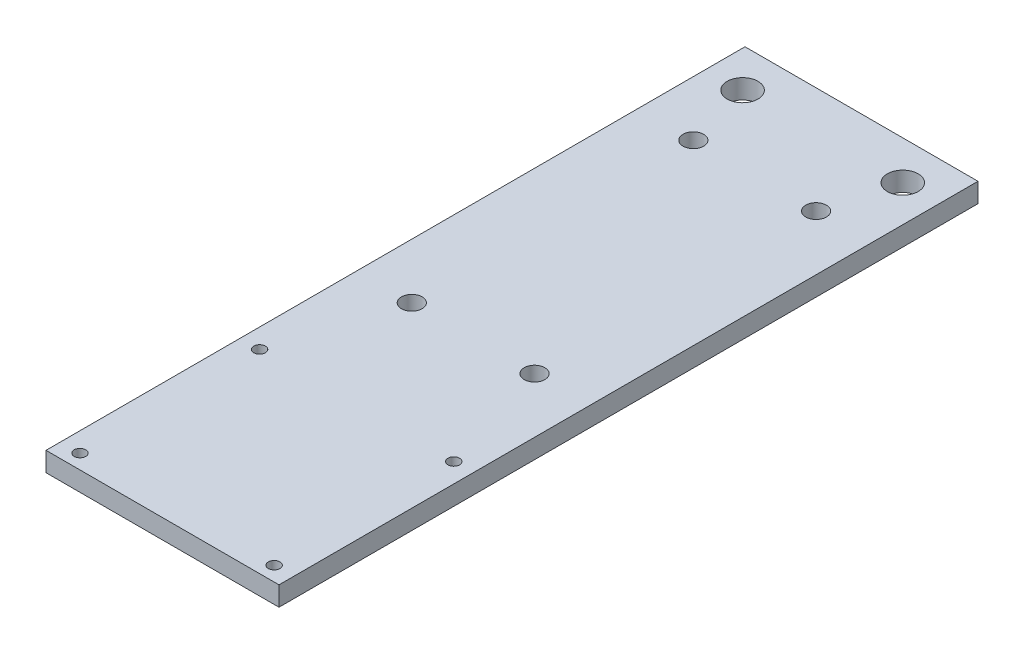
ISO-10303-21;
HEADER;
FILE_DESCRIPTION(('STEP AP214'),'2;1');
FILE_NAME('part.step','',(''),(''),'','','');
FILE_SCHEMA(('AUTOMOTIVE_DESIGN { 1 0 10303 214 1 1 1 1 }'));
ENDSEC;
DATA;
#1=APPLICATION_CONTEXT('core data for automotive mechanical design processes');
#2=APPLICATION_PROTOCOL_DEFINITION('international standard','automotive_design',2000,#1);
#3=PRODUCT_CONTEXT('',#1,'mechanical');
#4=PRODUCT('Part','Part','',(#3));
#5=PRODUCT_RELATED_PRODUCT_CATEGORY('part','',(#4));
#6=PRODUCT_DEFINITION_FORMATION('','',#4);
#7=PRODUCT_DEFINITION_CONTEXT('part definition',#1,'design');
#8=PRODUCT_DEFINITION('design','',#6,#7);
#9=PRODUCT_DEFINITION_SHAPE('','',#8);
#10=(LENGTH_UNIT() NAMED_UNIT(*) SI_UNIT(.MILLI.,.METRE.));
#11=(NAMED_UNIT(*) PLANE_ANGLE_UNIT() SI_UNIT($,.RADIAN.));
#12=(NAMED_UNIT(*) SI_UNIT($,.STERADIAN.) SOLID_ANGLE_UNIT());
#13=UNCERTAINTY_MEASURE_WITH_UNIT(LENGTH_MEASURE(1.E-05),#10,'distance_accuracy_value','');
#14=(GEOMETRIC_REPRESENTATION_CONTEXT(3) GLOBAL_UNCERTAINTY_ASSIGNED_CONTEXT((#13)) GLOBAL_UNIT_ASSIGNED_CONTEXT((#10,
#11,#12)) REPRESENTATION_CONTEXT('',''));
#15=CARTESIAN_POINT('',(0.,0.,0.));
#16=DIRECTION('',(0.,0.,1.));
#17=DIRECTION('',(1.,0.,0.));
#18=AXIS2_PLACEMENT_3D('',#15,#16,#17);
#19=CARTESIAN_POINT('',(0.,0.,0.));
#20=DIRECTION('',(0.,-1.,0.));
#21=DIRECTION('',(0.,0.,-1.));
#22=AXIS2_PLACEMENT_3D('',#19,#20,#21);
#23=PLANE('',#22);
#24=CARTESIAN_POINT('',(-26.19375,0.,-101.6));
#25=DIRECTION('',(0.,1.,0.));
#26=DIRECTION('',(0.,0.,1.));
#27=AXIS2_PLACEMENT_3D('',#24,#25,#26);
#28=CIRCLE('',#27,5.0419);
#29=CARTESIAN_POINT('',(-26.19375,0.,-96.5581));
#30=VERTEX_POINT('',#29);
#31=EDGE_CURVE('E208',#30,#30,#28,.T.);
#32=ORIENTED_EDGE('',*,*,#31,.T.);
#33=EDGE_LOOP('',(#32));
#34=FACE_BOUND('',#33,.T.);
#35=CARTESIAN_POINT('',(26.19375,0.,-101.6));
#36=DIRECTION('',(0.,1.,0.));
#37=DIRECTION('',(0.,0.,1.));
#38=AXIS2_PLACEMENT_3D('',#35,#36,#37);
#39=CIRCLE('',#38,5.0419);
#40=CARTESIAN_POINT('',(26.19375,0.,-96.5581));
#41=VERTEX_POINT('',#40);
#42=EDGE_CURVE('E200',#41,#41,#39,.T.);
#43=ORIENTED_EDGE('',*,*,#42,.T.);
#44=EDGE_LOOP('',(#43));
#45=FACE_BOUND('',#44,.T.);
#46=CARTESIAN_POINT('',(-31.75,0.,50.8));
#47=DIRECTION('',(0.,1.,0.));
#48=DIRECTION('',(0.,0.,1.));
#49=AXIS2_PLACEMENT_3D('',#46,#47,#48);
#50=CIRCLE('',#49,1.89865);
#51=CARTESIAN_POINT('',(-31.75,0.,52.69865));
#52=VERTEX_POINT('',#51);
#53=EDGE_CURVE('E192',#52,#52,#50,.T.);
#54=ORIENTED_EDGE('',*,*,#53,.T.);
#55=EDGE_LOOP('',(#54));
#56=FACE_BOUND('',#55,.T.);
#57=DIRECTION('',(0.,0.,-1.));
#58=VECTOR('',#57,1.);
#59=CARTESIAN_POINT('',(38.1,0.,114.3));
#60=LINE('',#59,#58);
#61=CARTESIAN_POINT('',(38.1,0.,114.3));
#62=VERTEX_POINT('',#61);
#63=CARTESIAN_POINT('',(38.1,0.,-114.3));
#64=VERTEX_POINT('',#63);
#65=EDGE_CURVE('E116',#62,#64,#60,.T.);
#66=ORIENTED_EDGE('',*,*,#65,.F.);
#67=DIRECTION('',(1.,0.,0.));
#68=VECTOR('',#67,1.);
#69=CARTESIAN_POINT('',(-38.1,0.,114.3));
#70=LINE('',#69,#68);
#71=CARTESIAN_POINT('',(-38.1,0.,114.3));
#72=VERTEX_POINT('',#71);
#73=EDGE_CURVE('E88',#72,#62,#70,.T.);
#74=ORIENTED_EDGE('',*,*,#73,.F.);
#75=DIRECTION('',(0.,0.,1.));
#76=VECTOR('',#75,1.);
#77=CARTESIAN_POINT('',(-38.1,0.,114.3));
#78=LINE('',#77,#76);
#79=CARTESIAN_POINT('',(-38.1,0.,-114.3));
#80=VERTEX_POINT('',#79);
#81=EDGE_CURVE('E82',#80,#72,#78,.T.);
#82=ORIENTED_EDGE('',*,*,#81,.F.);
#83=DIRECTION('',(-1.,0.,0.));
#84=VECTOR('',#83,1.);
#85=CARTESIAN_POINT('',(-38.1,0.,-114.3));
#86=LINE('',#85,#84);
#87=EDGE_CURVE('E105',#64,#80,#86,.T.);
#88=ORIENTED_EDGE('',*,*,#87,.F.);
#89=EDGE_LOOP('',(#66,#74,#82,#88));
#90=FACE_BOUND('',#89,.T.);
#91=CARTESIAN_POINT('',(20.066,0.,-79.375));
#92=DIRECTION('',(0.,1.,0.));
#93=DIRECTION('',(0.,0.,1.));
#94=AXIS2_PLACEMENT_3D('',#91,#92,#93);
#95=CIRCLE('',#94,3.3782);
#96=CARTESIAN_POINT('',(20.066,0.,-75.9968));
#97=VERTEX_POINT('',#96);
#98=EDGE_CURVE('E120',#97,#97,#95,.T.);
#99=ORIENTED_EDGE('',*,*,#98,.T.);
#100=EDGE_LOOP('',(#99));
#101=FACE_BOUND('',#100,.T.);
#102=CARTESIAN_POINT('',(-20.066,0.,12.7));
#103=DIRECTION('',(0.,1.,0.));
#104=DIRECTION('',(0.,0.,1.));
#105=AXIS2_PLACEMENT_3D('',#102,#103,#104);
#106=CIRCLE('',#105,3.3782);
#107=CARTESIAN_POINT('',(-20.066,0.,16.0782));
#108=VERTEX_POINT('',#107);
#109=EDGE_CURVE('E144',#108,#108,#106,.T.);
#110=ORIENTED_EDGE('',*,*,#109,.T.);
#111=EDGE_LOOP('',(#110));
#112=FACE_BOUND('',#111,.T.);
#113=CARTESIAN_POINT('',(20.066,0.,12.7));
#114=DIRECTION('',(0.,1.,0.));
#115=DIRECTION('',(0.,0.,1.));
#116=AXIS2_PLACEMENT_3D('',#113,#114,#115);
#117=CIRCLE('',#116,3.3782);
#118=CARTESIAN_POINT('',(20.066,0.,16.0782));
#119=VERTEX_POINT('',#118);
#120=EDGE_CURVE('E152',#119,#119,#117,.T.);
#121=ORIENTED_EDGE('',*,*,#120,.T.);
#122=EDGE_LOOP('',(#121));
#123=FACE_BOUND('',#122,.T.);
#124=CARTESIAN_POINT('',(-20.066,0.,-79.375));
#125=DIRECTION('',(0.,1.,0.));
#126=DIRECTION('',(0.,0.,1.));
#127=AXIS2_PLACEMENT_3D('',#124,#125,#126);
#128=CIRCLE('',#127,3.3782);
#129=CARTESIAN_POINT('',(-20.066,0.,-75.9968));
#130=VERTEX_POINT('',#129);
#131=EDGE_CURVE('E160',#130,#130,#128,.T.);
#132=ORIENTED_EDGE('',*,*,#131,.T.);
#133=EDGE_LOOP('',(#132));
#134=FACE_BOUND('',#133,.T.);
#135=CARTESIAN_POINT('',(31.75,0.,109.5375));
#136=DIRECTION('',(0.,1.,0.));
#137=DIRECTION('',(0.,0.,1.));
#138=AXIS2_PLACEMENT_3D('',#135,#136,#137);
#139=CIRCLE('',#138,1.89864999999999);
#140=CARTESIAN_POINT('',(31.75,0.,111.43615));
#141=VERTEX_POINT('',#140);
#142=EDGE_CURVE('E168',#141,#141,#139,.T.);
#143=ORIENTED_EDGE('',*,*,#142,.T.);
#144=EDGE_LOOP('',(#143));
#145=FACE_BOUND('',#144,.T.);
#146=CARTESIAN_POINT('',(31.75,0.,50.8));
#147=DIRECTION('',(0.,1.,0.));
#148=DIRECTION('',(0.,0.,1.));
#149=AXIS2_PLACEMENT_3D('',#146,#147,#148);
#150=CIRCLE('',#149,1.89864999999999);
#151=CARTESIAN_POINT('',(31.75,0.,52.69865));
#152=VERTEX_POINT('',#151);
#153=EDGE_CURVE('E176',#152,#152,#150,.T.);
#154=ORIENTED_EDGE('',*,*,#153,.T.);
#155=EDGE_LOOP('',(#154));
#156=FACE_BOUND('',#155,.T.);
#157=CARTESIAN_POINT('',(-31.75,0.,109.5375));
#158=DIRECTION('',(0.,1.,0.));
#159=DIRECTION('',(0.,0.,1.));
#160=AXIS2_PLACEMENT_3D('',#157,#158,#159);
#161=CIRCLE('',#160,1.89865);
#162=CARTESIAN_POINT('',(-31.75,0.,111.43615));
#163=VERTEX_POINT('',#162);
#164=EDGE_CURVE('E184',#163,#163,#161,.T.);
#165=ORIENTED_EDGE('',*,*,#164,.T.);
#166=EDGE_LOOP('',(#165));
#167=FACE_BOUND('',#166,.T.);
#168=ADVANCED_FACE('F47',(#34,#45,#56,#90,#101,#112,#123,#134,#145,#156,#167),#23,.T.);
#169=CARTESIAN_POINT('',(38.1,6.35,114.3));
#170=DIRECTION('',(-1.,0.,0.));
#171=DIRECTION('',(0.,0.,1.));
#172=AXIS2_PLACEMENT_3D('',#169,#170,#171);
#173=PLANE('',#172);
#174=ORIENTED_EDGE('',*,*,#65,.T.);
#175=DIRECTION('',(0.,-1.,0.));
#176=VECTOR('',#175,1.);
#177=CARTESIAN_POINT('',(38.1,6.35,-114.3));
#178=LINE('',#177,#176);
#179=CARTESIAN_POINT('',(38.1,6.35,-114.3));
#180=VERTEX_POINT('',#179);
#181=EDGE_CURVE('E11',#180,#64,#178,.T.);
#182=ORIENTED_EDGE('',*,*,#181,.F.);
#183=DIRECTION('',(0.,0.,-1.));
#184=VECTOR('',#183,1.);
#185=CARTESIAN_POINT('',(38.1,6.35,114.3));
#186=LINE('',#185,#184);
#187=CARTESIAN_POINT('',(38.1,6.35,114.3));
#188=VERTEX_POINT('',#187);
#189=EDGE_CURVE('E100',#188,#180,#186,.T.);
#190=ORIENTED_EDGE('',*,*,#189,.F.);
#191=DIRECTION('',(0.,-1.,0.));
#192=VECTOR('',#191,1.);
#193=CARTESIAN_POINT('',(38.1,6.35,114.3));
#194=LINE('',#193,#192);
#195=EDGE_CURVE('E112',#188,#62,#194,.T.);
#196=ORIENTED_EDGE('',*,*,#195,.T.);
#197=EDGE_LOOP('',(#174,#182,#190,#196));
#198=FACE_BOUND('',#197,.T.);
#199=ADVANCED_FACE('F49',(#198),#173,.F.);
#200=CARTESIAN_POINT('',(-38.1,6.35,-114.3));
#201=DIRECTION('',(0.,0.,1.));
#202=DIRECTION('',(1.,0.,0.));
#203=AXIS2_PLACEMENT_3D('',#200,#201,#202);
#204=PLANE('',#203);
#205=ORIENTED_EDGE('',*,*,#87,.T.);
#206=DIRECTION('',(0.,-1.,0.));
#207=VECTOR('',#206,1.);
#208=CARTESIAN_POINT('',(-38.1,6.35,-114.3));
#209=LINE('',#208,#207);
#210=CARTESIAN_POINT('',(-38.1,6.35,-114.3));
#211=VERTEX_POINT('',#210);
#212=EDGE_CURVE('E57',#211,#80,#209,.T.);
#213=ORIENTED_EDGE('',*,*,#212,.F.);
#214=DIRECTION('',(-1.,0.,0.));
#215=VECTOR('',#214,1.);
#216=CARTESIAN_POINT('',(-38.1,6.35,-114.3));
#217=LINE('',#216,#215);
#218=EDGE_CURVE('E95',#180,#211,#217,.T.);
#219=ORIENTED_EDGE('',*,*,#218,.F.);
#220=ORIENTED_EDGE('',*,*,#181,.T.);
#221=EDGE_LOOP('',(#205,#213,#219,#220));
#222=FACE_BOUND('',#221,.T.);
#223=ADVANCED_FACE('F104',(#222),#204,.F.);
#224=CARTESIAN_POINT('',(-38.1,6.35,114.3));
#225=DIRECTION('',(1.,0.,0.));
#226=DIRECTION('',(0.,0.,-1.));
#227=AXIS2_PLACEMENT_3D('',#224,#225,#226);
#228=PLANE('',#227);
#229=ORIENTED_EDGE('',*,*,#81,.T.);
#230=DIRECTION('',(0.,-1.,0.));
#231=VECTOR('',#230,1.);
#232=CARTESIAN_POINT('',(-38.1,6.35,114.3));
#233=LINE('',#232,#231);
#234=CARTESIAN_POINT('',(-38.1,6.35,114.3));
#235=VERTEX_POINT('',#234);
#236=EDGE_CURVE('E107',#235,#72,#233,.T.);
#237=ORIENTED_EDGE('',*,*,#236,.F.);
#238=DIRECTION('',(0.,0.,1.));
#239=VECTOR('',#238,1.);
#240=CARTESIAN_POINT('',(-38.1,6.35,114.3));
#241=LINE('',#240,#239);
#242=EDGE_CURVE('E98',#211,#235,#241,.T.);
#243=ORIENTED_EDGE('',*,*,#242,.F.);
#244=ORIENTED_EDGE('',*,*,#212,.T.);
#245=EDGE_LOOP('',(#229,#237,#243,#244));
#246=FACE_BOUND('',#245,.T.);
#247=ADVANCED_FACE('F108',(#246),#228,.F.);
#248=CARTESIAN_POINT('',(-38.1,6.35,114.3));
#249=DIRECTION('',(0.,0.,-1.));
#250=DIRECTION('',(-1.,0.,0.));
#251=AXIS2_PLACEMENT_3D('',#248,#249,#250);
#252=PLANE('',#251);
#253=ORIENTED_EDGE('',*,*,#73,.T.);
#254=ORIENTED_EDGE('',*,*,#195,.F.);
#255=DIRECTION('',(1.,0.,0.));
#256=VECTOR('',#255,1.);
#257=CARTESIAN_POINT('',(-38.1,6.35,114.3));
#258=LINE('',#257,#256);
#259=EDGE_CURVE('E65',#235,#188,#258,.T.);
#260=ORIENTED_EDGE('',*,*,#259,.F.);
#261=ORIENTED_EDGE('',*,*,#236,.T.);
#262=EDGE_LOOP('',(#253,#254,#260,#261));
#263=FACE_BOUND('',#262,.T.);
#264=ADVANCED_FACE('F130',(#263),#252,.F.);
#265=CARTESIAN_POINT('',(0.,6.35,0.));
#266=DIRECTION('',(0.,-1.,0.));
#267=DIRECTION('',(0.,0.,-1.));
#268=AXIS2_PLACEMENT_3D('',#265,#266,#267);
#269=PLANE('',#268);
#270=CARTESIAN_POINT('',(-26.19375,6.35,-101.6));
#271=DIRECTION('',(0.,1.,0.));
#272=DIRECTION('',(0.,0.,1.));
#273=AXIS2_PLACEMENT_3D('',#270,#271,#272);
#274=CIRCLE('',#273,5.0419);
#275=CARTESIAN_POINT('',(-26.19375,6.35,-96.5581));
#276=VERTEX_POINT('',#275);
#277=EDGE_CURVE('E212',#276,#276,#274,.T.);
#278=ORIENTED_EDGE('',*,*,#277,.F.);
#279=EDGE_LOOP('',(#278));
#280=FACE_BOUND('',#279,.T.);
#281=CARTESIAN_POINT('',(26.19375,6.35,-101.6));
#282=DIRECTION('',(0.,1.,0.));
#283=DIRECTION('',(0.,0.,1.));
#284=AXIS2_PLACEMENT_3D('',#281,#282,#283);
#285=CIRCLE('',#284,5.0419);
#286=CARTESIAN_POINT('',(26.19375,6.35,-96.5581));
#287=VERTEX_POINT('',#286);
#288=EDGE_CURVE('E204',#287,#287,#285,.T.);
#289=ORIENTED_EDGE('',*,*,#288,.F.);
#290=EDGE_LOOP('',(#289));
#291=FACE_BOUND('',#290,.T.);
#292=CARTESIAN_POINT('',(-31.75,6.35,50.8));
#293=DIRECTION('',(0.,1.,0.));
#294=DIRECTION('',(0.,0.,1.));
#295=AXIS2_PLACEMENT_3D('',#292,#293,#294);
#296=CIRCLE('',#295,1.89865);
#297=CARTESIAN_POINT('',(-31.75,6.35,52.69865));
#298=VERTEX_POINT('',#297);
#299=EDGE_CURVE('E196',#298,#298,#296,.T.);
#300=ORIENTED_EDGE('',*,*,#299,.F.);
#301=EDGE_LOOP('',(#300));
#302=FACE_BOUND('',#301,.T.);
#303=CARTESIAN_POINT('',(-31.75,6.35,109.5375));
#304=DIRECTION('',(0.,1.,0.));
#305=DIRECTION('',(0.,0.,1.));
#306=AXIS2_PLACEMENT_3D('',#303,#304,#305);
#307=CIRCLE('',#306,1.89865);
#308=CARTESIAN_POINT('',(-31.75,6.35,111.43615));
#309=VERTEX_POINT('',#308);
#310=EDGE_CURVE('E188',#309,#309,#307,.T.);
#311=ORIENTED_EDGE('',*,*,#310,.F.);
#312=EDGE_LOOP('',(#311));
#313=FACE_BOUND('',#312,.T.);
#314=CARTESIAN_POINT('',(31.75,6.35,50.8));
#315=DIRECTION('',(0.,1.,0.));
#316=DIRECTION('',(0.,0.,1.));
#317=AXIS2_PLACEMENT_3D('',#314,#315,#316);
#318=CIRCLE('',#317,1.89865);
#319=CARTESIAN_POINT('',(31.75,6.35,52.69865));
#320=VERTEX_POINT('',#319);
#321=EDGE_CURVE('E180',#320,#320,#318,.T.);
#322=ORIENTED_EDGE('',*,*,#321,.F.);
#323=EDGE_LOOP('',(#322));
#324=FACE_BOUND('',#323,.T.);
#325=CARTESIAN_POINT('',(31.75,6.35,109.5375));
#326=DIRECTION('',(0.,1.,0.));
#327=DIRECTION('',(0.,0.,1.));
#328=AXIS2_PLACEMENT_3D('',#325,#326,#327);
#329=CIRCLE('',#328,1.89865);
#330=CARTESIAN_POINT('',(31.75,6.35,111.43615));
#331=VERTEX_POINT('',#330);
#332=EDGE_CURVE('E172',#331,#331,#329,.T.);
#333=ORIENTED_EDGE('',*,*,#332,.F.);
#334=EDGE_LOOP('',(#333));
#335=FACE_BOUND('',#334,.T.);
#336=CARTESIAN_POINT('',(-20.066,6.35,-79.375));
#337=DIRECTION('',(0.,1.,0.));
#338=DIRECTION('',(0.,0.,1.));
#339=AXIS2_PLACEMENT_3D('',#336,#337,#338);
#340=CIRCLE('',#339,3.3782);
#341=CARTESIAN_POINT('',(-20.066,6.35,-75.9968));
#342=VERTEX_POINT('',#341);
#343=EDGE_CURVE('E164',#342,#342,#340,.T.);
#344=ORIENTED_EDGE('',*,*,#343,.F.);
#345=EDGE_LOOP('',(#344));
#346=FACE_BOUND('',#345,.T.);
#347=CARTESIAN_POINT('',(20.066,6.35,12.7));
#348=DIRECTION('',(0.,1.,0.));
#349=DIRECTION('',(0.,0.,1.));
#350=AXIS2_PLACEMENT_3D('',#347,#348,#349);
#351=CIRCLE('',#350,3.3782);
#352=CARTESIAN_POINT('',(20.066,6.35,16.0782));
#353=VERTEX_POINT('',#352);
#354=EDGE_CURVE('E156',#353,#353,#351,.T.);
#355=ORIENTED_EDGE('',*,*,#354,.F.);
#356=EDGE_LOOP('',(#355));
#357=FACE_BOUND('',#356,.T.);
#358=CARTESIAN_POINT('',(-20.066,6.35,12.7));
#359=DIRECTION('',(0.,1.,0.));
#360=DIRECTION('',(0.,0.,1.));
#361=AXIS2_PLACEMENT_3D('',#358,#359,#360);
#362=CIRCLE('',#361,3.3782);
#363=CARTESIAN_POINT('',(-20.066,6.35,16.0782));
#364=VERTEX_POINT('',#363);
#365=EDGE_CURVE('E148',#364,#364,#362,.T.);
#366=ORIENTED_EDGE('',*,*,#365,.F.);
#367=EDGE_LOOP('',(#366));
#368=FACE_BOUND('',#367,.T.);
#369=CARTESIAN_POINT('',(20.066,6.35,-79.375));
#370=DIRECTION('',(0.,1.,0.));
#371=DIRECTION('',(0.,0.,1.));
#372=AXIS2_PLACEMENT_3D('',#369,#370,#371);
#373=CIRCLE('',#372,3.3782);
#374=CARTESIAN_POINT('',(20.066,6.35,-75.9968));
#375=VERTEX_POINT('',#374);
#376=EDGE_CURVE('E140',#375,#375,#373,.T.);
#377=ORIENTED_EDGE('',*,*,#376,.F.);
#378=EDGE_LOOP('',(#377));
#379=FACE_BOUND('',#378,.T.);
#380=ORIENTED_EDGE('',*,*,#189,.T.);
#381=ORIENTED_EDGE('',*,*,#218,.T.);
#382=ORIENTED_EDGE('',*,*,#242,.T.);
#383=ORIENTED_EDGE('',*,*,#259,.T.);
#384=EDGE_LOOP('',(#380,#381,#382,#383));
#385=FACE_BOUND('',#384,.T.);
#386=ADVANCED_FACE('F96',(#280,#291,#302,#313,#324,#335,#346,#357,#368,#379,#385),#269,.F.);
#387=CARTESIAN_POINT('',(20.066,6.35,-79.375));
#388=DIRECTION('',(0.,1.,0.));
#389=DIRECTION('',(0.,0.,1.));
#390=AXIS2_PLACEMENT_3D('',#387,#388,#389);
#391=CYLINDRICAL_SURFACE('',#390,3.3782);
#392=ORIENTED_EDGE('',*,*,#98,.F.);
#393=EDGE_LOOP('',(#392));
#394=FACE_BOUND('',#393,.T.);
#395=ORIENTED_EDGE('',*,*,#376,.T.);
#396=EDGE_LOOP('',(#395));
#397=FACE_BOUND('',#396,.T.);
#398=ADVANCED_FACE('F221',(#394,#397),#391,.F.);
#399=CARTESIAN_POINT('',(-20.066,6.35,12.7));
#400=DIRECTION('',(0.,1.,0.));
#401=DIRECTION('',(0.,0.,1.));
#402=AXIS2_PLACEMENT_3D('',#399,#400,#401);
#403=CYLINDRICAL_SURFACE('',#402,3.3782);
#404=ORIENTED_EDGE('',*,*,#109,.F.);
#405=EDGE_LOOP('',(#404));
#406=FACE_BOUND('',#405,.T.);
#407=ORIENTED_EDGE('',*,*,#365,.T.);
#408=EDGE_LOOP('',(#407));
#409=FACE_BOUND('',#408,.T.);
#410=ADVANCED_FACE('F242',(#406,#409),#403,.F.);
#411=CARTESIAN_POINT('',(20.066,6.35,12.7));
#412=DIRECTION('',(0.,1.,0.));
#413=DIRECTION('',(0.,0.,1.));
#414=AXIS2_PLACEMENT_3D('',#411,#412,#413);
#415=CYLINDRICAL_SURFACE('',#414,3.3782);
#416=ORIENTED_EDGE('',*,*,#120,.F.);
#417=EDGE_LOOP('',(#416));
#418=FACE_BOUND('',#417,.T.);
#419=ORIENTED_EDGE('',*,*,#354,.T.);
#420=EDGE_LOOP('',(#419));
#421=FACE_BOUND('',#420,.T.);
#422=ADVANCED_FACE('F248',(#418,#421),#415,.F.);
#423=CARTESIAN_POINT('',(-20.066,6.35,-79.375));
#424=DIRECTION('',(0.,1.,0.));
#425=DIRECTION('',(0.,0.,1.));
#426=AXIS2_PLACEMENT_3D('',#423,#424,#425);
#427=CYLINDRICAL_SURFACE('',#426,3.3782);
#428=ORIENTED_EDGE('',*,*,#131,.F.);
#429=EDGE_LOOP('',(#428));
#430=FACE_BOUND('',#429,.T.);
#431=ORIENTED_EDGE('',*,*,#343,.T.);
#432=EDGE_LOOP('',(#431));
#433=FACE_BOUND('',#432,.T.);
#434=ADVANCED_FACE('F346',(#430,#433),#427,.F.);
#435=CARTESIAN_POINT('',(31.75,6.35,109.5375));
#436=DIRECTION('',(0.,1.,0.));
#437=DIRECTION('',(0.,0.,1.));
#438=AXIS2_PLACEMENT_3D('',#435,#436,#437);
#439=CYLINDRICAL_SURFACE('',#438,1.89865);
#440=ORIENTED_EDGE('',*,*,#142,.F.);
#441=EDGE_LOOP('',(#440));
#442=FACE_BOUND('',#441,.T.);
#443=ORIENTED_EDGE('',*,*,#332,.T.);
#444=EDGE_LOOP('',(#443));
#445=FACE_BOUND('',#444,.T.);
#446=ADVANCED_FACE('F337',(#442,#445),#439,.F.);
#447=CARTESIAN_POINT('',(31.75,6.35,50.8));
#448=DIRECTION('',(0.,1.,0.));
#449=DIRECTION('',(0.,0.,1.));
#450=AXIS2_PLACEMENT_3D('',#447,#448,#449);
#451=CYLINDRICAL_SURFACE('',#450,1.89865);
#452=ORIENTED_EDGE('',*,*,#153,.F.);
#453=EDGE_LOOP('',(#452));
#454=FACE_BOUND('',#453,.T.);
#455=ORIENTED_EDGE('',*,*,#321,.T.);
#456=EDGE_LOOP('',(#455));
#457=FACE_BOUND('',#456,.T.);
#458=ADVANCED_FACE('F327',(#454,#457),#451,.F.);
#459=CARTESIAN_POINT('',(-31.75,6.35,109.5375));
#460=DIRECTION('',(0.,1.,0.));
#461=DIRECTION('',(0.,0.,1.));
#462=AXIS2_PLACEMENT_3D('',#459,#460,#461);
#463=CYLINDRICAL_SURFACE('',#462,1.89865);
#464=ORIENTED_EDGE('',*,*,#164,.F.);
#465=EDGE_LOOP('',(#464));
#466=FACE_BOUND('',#465,.T.);
#467=ORIENTED_EDGE('',*,*,#310,.T.);
#468=EDGE_LOOP('',(#467));
#469=FACE_BOUND('',#468,.T.);
#470=ADVANCED_FACE('F318',(#466,#469),#463,.F.);
#471=CARTESIAN_POINT('',(-31.75,6.35,50.8));
#472=DIRECTION('',(0.,1.,0.));
#473=DIRECTION('',(0.,0.,1.));
#474=AXIS2_PLACEMENT_3D('',#471,#472,#473);
#475=CYLINDRICAL_SURFACE('',#474,1.89865);
#476=ORIENTED_EDGE('',*,*,#53,.F.);
#477=EDGE_LOOP('',(#476));
#478=FACE_BOUND('',#477,.T.);
#479=ORIENTED_EDGE('',*,*,#299,.T.);
#480=EDGE_LOOP('',(#479));
#481=FACE_BOUND('',#480,.T.);
#482=ADVANCED_FACE('F295',(#478,#481),#475,.F.);
#483=CARTESIAN_POINT('',(26.19375,6.35,-101.6));
#484=DIRECTION('',(0.,1.,0.));
#485=DIRECTION('',(0.,0.,1.));
#486=AXIS2_PLACEMENT_3D('',#483,#484,#485);
#487=CYLINDRICAL_SURFACE('',#486,5.0419);
#488=ORIENTED_EDGE('',*,*,#42,.F.);
#489=EDGE_LOOP('',(#488));
#490=FACE_BOUND('',#489,.T.);
#491=ORIENTED_EDGE('',*,*,#288,.T.);
#492=EDGE_LOOP('',(#491));
#493=FACE_BOUND('',#492,.T.);
#494=ADVANCED_FACE('F290',(#490,#493),#487,.F.);
#495=CARTESIAN_POINT('',(-26.19375,6.35,-101.6));
#496=DIRECTION('',(0.,1.,0.));
#497=DIRECTION('',(0.,0.,1.));
#498=AXIS2_PLACEMENT_3D('',#495,#496,#497);
#499=CYLINDRICAL_SURFACE('',#498,5.0419);
#500=ORIENTED_EDGE('',*,*,#31,.F.);
#501=EDGE_LOOP('',(#500));
#502=FACE_BOUND('',#501,.T.);
#503=ORIENTED_EDGE('',*,*,#277,.T.);
#504=EDGE_LOOP('',(#503));
#505=FACE_BOUND('',#504,.T.);
#506=ADVANCED_FACE('F217',(#502,#505),#499,.F.);
#507=CLOSED_SHELL('',(#168,#199,#223,#247,#264,#386,#398,#410,#422,#434,#446,#458,#470,#482,
#494,#506));
#508=MANIFOLD_SOLID_BREP('B2',#507);
#509=ADVANCED_BREP_SHAPE_REPRESENTATION('',(#18,#508),#14);
#510=SHAPE_DEFINITION_REPRESENTATION(#9,#509);
ENDSEC;
END-ISO-10303-21;
